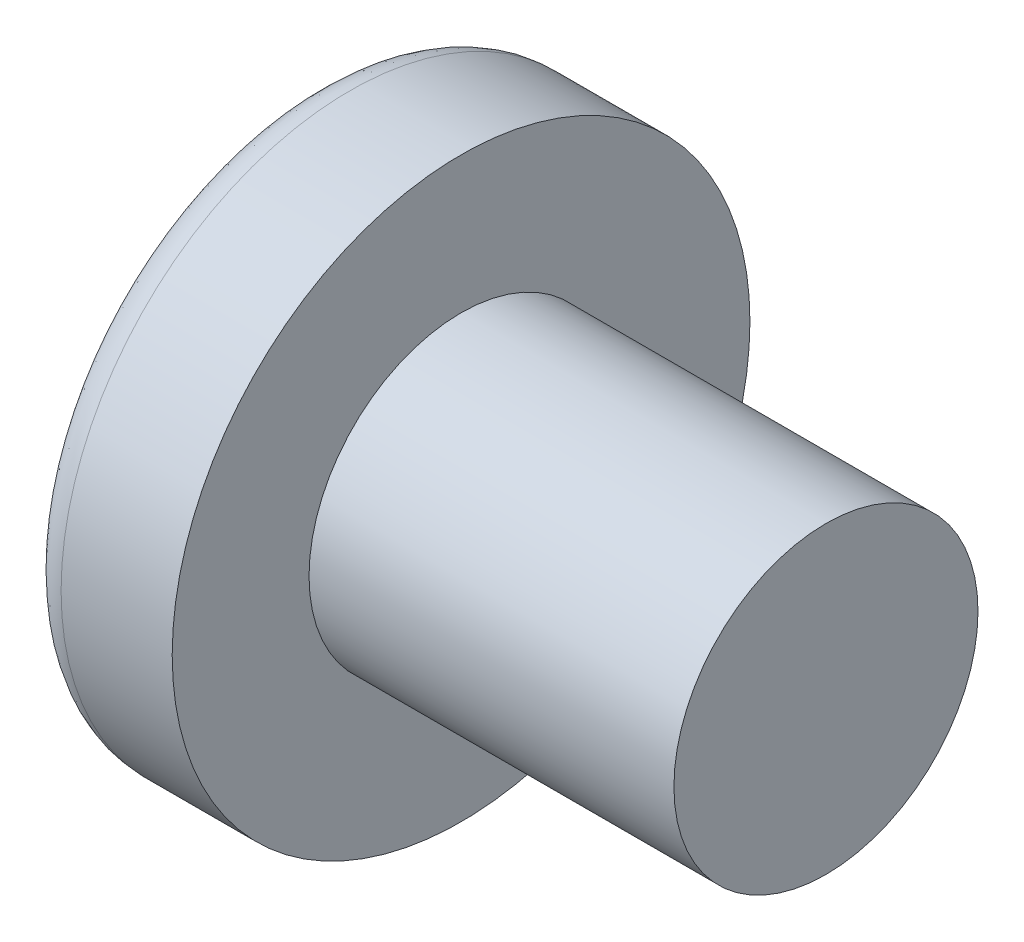
ISO-10303-21;
HEADER;
FILE_DESCRIPTION(('STEP AP214'),'2;1');
FILE_NAME('part.step','',(''),(''),'','','');
FILE_SCHEMA(('AUTOMOTIVE_DESIGN { 1 0 10303 214 1 1 1 1 }'));
ENDSEC;
DATA;
#1=APPLICATION_CONTEXT('core data for automotive mechanical design processes');
#2=APPLICATION_PROTOCOL_DEFINITION('international standard','automotive_design',2000,#1);
#3=PRODUCT_CONTEXT('',#1,'mechanical');
#4=PRODUCT('Part','Part','',(#3));
#5=PRODUCT_RELATED_PRODUCT_CATEGORY('part','',(#4));
#6=PRODUCT_DEFINITION_FORMATION('','',#4);
#7=PRODUCT_DEFINITION_CONTEXT('part definition',#1,'design');
#8=PRODUCT_DEFINITION('design','',#6,#7);
#9=PRODUCT_DEFINITION_SHAPE('','',#8);
#10=(LENGTH_UNIT() NAMED_UNIT(*) SI_UNIT(.MILLI.,.METRE.));
#11=(NAMED_UNIT(*) PLANE_ANGLE_UNIT() SI_UNIT($,.RADIAN.));
#12=(NAMED_UNIT(*) SI_UNIT($,.STERADIAN.) SOLID_ANGLE_UNIT());
#13=UNCERTAINTY_MEASURE_WITH_UNIT(LENGTH_MEASURE(1.E-05),#10,'distance_accuracy_value','');
#14=(GEOMETRIC_REPRESENTATION_CONTEXT(3) GLOBAL_UNCERTAINTY_ASSIGNED_CONTEXT((#13)) GLOBAL_UNIT_ASSIGNED_CONTEXT((#10,
#11,#12)) REPRESENTATION_CONTEXT('',''));
#15=CARTESIAN_POINT('',(0.,0.,0.));
#16=DIRECTION('',(0.,0.,1.));
#17=DIRECTION('',(1.,0.,0.));
#18=AXIS2_PLACEMENT_3D('',#15,#16,#17);
#19=CARTESIAN_POINT('',(8.,0.,0.));
#20=DIRECTION('',(-1.,0.,0.));
#21=DIRECTION('',(0.,1.,0.));
#22=AXIS2_PLACEMENT_3D('',#19,#20,#21);
#23=SPHERICAL_SURFACE('',#22,8.);
#24=CARTESIAN_POINT('',(1.37644815778014,0.,0.));
#25=DIRECTION('',(-1.,0.,0.));
#26=DIRECTION('',(0.,0.,1.));
#27=AXIS2_PLACEMENT_3D('',#24,#25,#26);
#28=CIRCLE('',#27,4.48648648648649);
#29=CARTESIAN_POINT('',(1.37644815778014,0.,4.48648648648649));
#30=VERTEX_POINT('',#29);
#31=EDGE_CURVE('E152',#30,#30,#28,.T.);
#32=ORIENTED_EDGE('',*,*,#31,.T.);
#33=EDGE_LOOP('',(#32));
#34=FACE_BOUND('',#33,.T.);
#35=CARTESIAN_POINT('',(7.98502567027952,-0.176697090701654,0.));
#36=DIRECTION('',(-0.0844430766861806,-0.996428304896931,0.));
#37=DIRECTION('',(0.996428304896931,-0.0844430766861806,0.));
#38=AXIS2_PLACEMENT_3D('',#35,#36,#37);
#39=CIRCLE('',#38,7.99803437774476);
#40=CARTESIAN_POINT('',(0.325131322777779,0.472446498069672,2.20752918301319));
#41=VERTEX_POINT('',#40);
#42=CARTESIAN_POINT('',(0.0309826509964171,0.497374351610471,0.497374351610473));
#43=VERTEX_POINT('',#42);
#44=EDGE_CURVE('E183',#41,#43,#39,.T.);
#45=ORIENTED_EDGE('',*,*,#44,.F.);
#46=CARTESIAN_POINT('',(6.31497138637622,0.,-2.25947018645006));
#47=DIRECTION('',(0.597823879730417,0.,0.801627475093059));
#48=DIRECTION('',(0.801627475093059,0.,-0.597823879730417));
#49=AXIS2_PLACEMENT_3D('',#46,#47,#48);
#50=CIRCLE('',#49,7.48702030502205);
#51=CARTESIAN_POINT('',(0.325131322777778,-0.472446498069688,2.20752918301318));
#52=VERTEX_POINT('',#51);
#53=EDGE_CURVE('E148',#41,#52,#50,.T.);
#54=ORIENTED_EDGE('',*,*,#53,.T.);
#55=CARTESIAN_POINT('',(7.98502567027952,0.176697090701654,0.));
#56=DIRECTION('',(-0.0844430766861805,0.996428304896931,0.));
#57=DIRECTION('',(-0.996428304896931,-0.0844430766861805,0.));
#58=AXIS2_PLACEMENT_3D('',#55,#56,#57);
#59=CIRCLE('',#58,7.99803437774476);
#60=CARTESIAN_POINT('',(0.0309826509964171,-0.497374351610475,0.497374351610473));
#61=VERTEX_POINT('',#60);
#62=EDGE_CURVE('E104',#61,#52,#59,.T.);
#63=ORIENTED_EDGE('',*,*,#62,.F.);
#64=CARTESIAN_POINT('',(7.98502567027952,0.,-0.176697090701654));
#65=DIRECTION('',(-0.0844430766861805,0.,-0.996428304896931));
#66=DIRECTION('',(-0.996428304896931,0.,0.0844430766861805));
#67=AXIS2_PLACEMENT_3D('',#64,#65,#66);
#68=CIRCLE('',#67,7.99803437774476);
#69=CARTESIAN_POINT('',(0.325131322777776,-2.20752918301318,0.47244649806968));
#70=VERTEX_POINT('',#69);
#71=EDGE_CURVE('E129',#70,#61,#68,.T.);
#72=ORIENTED_EDGE('',*,*,#71,.F.);
#73=CARTESIAN_POINT('',(6.31497138637622,2.25947018645006,0.));
#74=DIRECTION('',(0.597823879730417,-0.801627475093059,0.));
#75=DIRECTION('',(0.801627475093059,0.597823879730417,0.));
#76=AXIS2_PLACEMENT_3D('',#73,#74,#75);
#77=CIRCLE('',#76,7.48702030502205);
#78=CARTESIAN_POINT('',(0.325131322777776,-2.20752918301318,-0.47244649806968));
#79=VERTEX_POINT('',#78);
#80=EDGE_CURVE('E137',#70,#79,#77,.T.);
#81=ORIENTED_EDGE('',*,*,#80,.T.);
#82=CARTESIAN_POINT('',(7.98502567027952,0.,0.176697090701654));
#83=DIRECTION('',(-0.0844430766861806,0.,0.996428304896931));
#84=DIRECTION('',(0.996428304896931,0.,0.0844430766861806));
#85=AXIS2_PLACEMENT_3D('',#82,#83,#84);
#86=CIRCLE('',#85,7.99803437774476);
#87=CARTESIAN_POINT('',(0.0309826509964171,-0.497374351610471,-0.497374351610473));
#88=VERTEX_POINT('',#87);
#89=EDGE_CURVE('E47',#88,#79,#86,.T.);
#90=ORIENTED_EDGE('',*,*,#89,.F.);
#91=CARTESIAN_POINT('',(0.325131322777777,-0.472446498069672,-2.20752918301319));
#92=VERTEX_POINT('',#91);
#93=EDGE_CURVE('E190',#92,#88,#59,.T.);
#94=ORIENTED_EDGE('',*,*,#93,.F.);
#95=CARTESIAN_POINT('',(6.31497138637622,0.,2.25947018645006));
#96=DIRECTION('',(0.597823879730417,0.,-0.801627475093059));
#97=DIRECTION('',(-0.801627475093059,0.,-0.597823879730417));
#98=AXIS2_PLACEMENT_3D('',#95,#96,#97);
#99=CIRCLE('',#98,7.48702030502205);
#100=CARTESIAN_POINT('',(0.325131322777777,0.472446498069688,-2.20752918301318));
#101=VERTEX_POINT('',#100);
#102=EDGE_CURVE('E130',#92,#101,#99,.T.);
#103=ORIENTED_EDGE('',*,*,#102,.T.);
#104=CARTESIAN_POINT('',(0.0309826509964171,0.497374351610475,-0.497374351610473));
#105=VERTEX_POINT('',#104);
#106=EDGE_CURVE('E178',#105,#101,#39,.T.);
#107=ORIENTED_EDGE('',*,*,#106,.F.);
#108=CARTESIAN_POINT('',(0.325131322777778,2.20752918301318,-0.47244649806968));
#109=VERTEX_POINT('',#108);
#110=EDGE_CURVE('E40',#109,#105,#86,.T.);
#111=ORIENTED_EDGE('',*,*,#110,.F.);
#112=CARTESIAN_POINT('',(6.31497138637622,-2.25947018645007,0.));
#113=DIRECTION('',(0.597823879730417,0.801627475093059,0.));
#114=DIRECTION('',(-0.801627475093059,0.597823879730417,0.));
#115=AXIS2_PLACEMENT_3D('',#112,#113,#114);
#116=CIRCLE('',#115,7.48702030502205);
#117=CARTESIAN_POINT('',(0.325131322777778,2.20752918301318,0.47244649806968));
#118=VERTEX_POINT('',#117);
#119=EDGE_CURVE('E11',#109,#118,#116,.T.);
#120=ORIENTED_EDGE('',*,*,#119,.T.);
#121=EDGE_CURVE('E166',#43,#118,#68,.T.);
#122=ORIENTED_EDGE('',*,*,#121,.F.);
#123=EDGE_LOOP('',(#45,#54,#63,#72,#81,#90,#94,#103,#107,#111,#120,#122));
#124=FACE_BOUND('',#123,.T.);
#125=ADVANCED_FACE('F32',(#34,#124),#23,.T.);
#126=CARTESIAN_POINT('',(3.28522727272727,0.,-0.221590909090909));
#127=DIRECTION('',(-0.0844430766861806,0.,0.996428304896931));
#128=DIRECTION('',(0.996428304896931,0.,0.0844430766861806));
#129=AXIS2_PLACEMENT_3D('',#126,#127,#128);
#130=PLANE('',#129);
#131=ORIENTED_EDGE('',*,*,#110,.T.);
#132=DIRECTION('',(0.992894609445471,-0.0841436109699554,0.0841436109699551));
#133=VECTOR('',#132,1.);
#134=CARTESIAN_POINT('',(3.30374024870626,0.220022012821504,-0.220022012821503));
#135=LINE('',#134,#133);
#136=CARTESIAN_POINT('',(2.95,0.250000000000001,-0.249999999999999));
#137=VERTEX_POINT('',#136);
#138=EDGE_CURVE('E172',#105,#137,#135,.T.);
#139=ORIENTED_EDGE('',*,*,#138,.T.);
#140=DIRECTION('',(0.799784057588365,-0.596449127693018,0.0677783099651157));
#141=VECTOR('',#140,1.);
#142=CARTESIAN_POINT('',(0.,2.45,-0.5));
#143=LINE('',#142,#141);
#144=EDGE_CURVE('E153',#109,#137,#143,.T.);
#145=ORIENTED_EDGE('',*,*,#144,.F.);
#146=EDGE_LOOP('',(#131,#139,#145));
#147=FACE_BOUND('',#146,.T.);
#148=ADVANCED_FACE('F171',(#147),#130,.T.);
#149=DIRECTION('',(0.799784057588366,0.596449127693018,0.0677783099651157));
#150=VECTOR('',#149,1.);
#151=CARTESIAN_POINT('',(0.,-2.45,-0.5));
#152=LINE('',#151,#150);
#153=CARTESIAN_POINT('',(2.95,-0.25,-0.25));
#154=VERTEX_POINT('',#153);
#155=EDGE_CURVE('E138',#79,#154,#152,.T.);
#156=ORIENTED_EDGE('',*,*,#155,.T.);
#157=DIRECTION('',(-0.992894609445471,-0.0841436109699547,-0.0841436109699551));
#158=VECTOR('',#157,1.);
#159=CARTESIAN_POINT('',(3.30374024870626,-0.220022012821502,-0.220022012821503));
#160=LINE('',#159,#158);
#161=EDGE_CURVE('E193',#154,#88,#160,.T.);
#162=ORIENTED_EDGE('',*,*,#161,.T.);
#163=ORIENTED_EDGE('',*,*,#89,.T.);
#164=EDGE_LOOP('',(#156,#162,#163));
#165=FACE_BOUND('',#164,.T.);
#166=ADVANCED_FACE('F208',(#165),#130,.T.);
#167=CARTESIAN_POINT('',(3.28522727272727,0.,0.221590909090909));
#168=DIRECTION('',(-0.0844430766861805,0.,-0.996428304896931));
#169=DIRECTION('',(-0.996428304896931,0.,0.0844430766861805));
#170=AXIS2_PLACEMENT_3D('',#167,#168,#169);
#171=PLANE('',#170);
#172=DIRECTION('',(0.799784057588365,-0.596449127693018,-0.0677783099651157));
#173=VECTOR('',#172,1.);
#174=CARTESIAN_POINT('',(0.,2.45,0.5));
#175=LINE('',#174,#173);
#176=CARTESIAN_POINT('',(2.95,0.25,0.25));
#177=VERTEX_POINT('',#176);
#178=EDGE_CURVE('E209',#118,#177,#175,.T.);
#179=ORIENTED_EDGE('',*,*,#178,.T.);
#180=DIRECTION('',(-0.992894609445471,0.0841436109699548,0.084143610969955));
#181=VECTOR('',#180,1.);
#182=CARTESIAN_POINT('',(3.30374024870626,0.220022012821502,0.220022012821503));
#183=LINE('',#182,#181);
#184=EDGE_CURVE('E187',#177,#43,#183,.T.);
#185=ORIENTED_EDGE('',*,*,#184,.T.);
#186=ORIENTED_EDGE('',*,*,#121,.T.);
#187=EDGE_LOOP('',(#179,#185,#186));
#188=FACE_BOUND('',#187,.T.);
#189=ADVANCED_FACE('F213',(#188),#171,.T.);
#190=ORIENTED_EDGE('',*,*,#71,.T.);
#191=DIRECTION('',(0.992894609445471,0.0841436109699553,-0.084143610969955));
#192=VECTOR('',#191,1.);
#193=CARTESIAN_POINT('',(3.30374024870626,-0.220022012821504,0.220022012821503));
#194=LINE('',#193,#192);
#195=CARTESIAN_POINT('',(2.95,-0.250000000000001,0.249999999999999));
#196=VERTEX_POINT('',#195);
#197=EDGE_CURVE('E102',#61,#196,#194,.T.);
#198=ORIENTED_EDGE('',*,*,#197,.T.);
#199=DIRECTION('',(0.799784057588366,0.596449127693018,-0.0677783099651156));
#200=VECTOR('',#199,1.);
#201=CARTESIAN_POINT('',(0.,-2.45,0.499999999999999));
#202=LINE('',#201,#200);
#203=EDGE_CURVE('E127',#70,#196,#202,.T.);
#204=ORIENTED_EDGE('',*,*,#203,.F.);
#205=EDGE_LOOP('',(#190,#198,#204));
#206=FACE_BOUND('',#205,.T.);
#207=ADVANCED_FACE('F126',(#206),#171,.T.);
#208=CARTESIAN_POINT('',(-25.4,0.,0.));
#209=DIRECTION('',(-1.,0.,0.));
#210=DIRECTION('',(0.,0.,1.));
#211=AXIS2_PLACEMENT_3D('',#208,#209,#210);
#212=CYLINDRICAL_SURFACE('',#211,2.5);
#213=CARTESIAN_POINT('',(9.7,0.,0.));
#214=DIRECTION('',(-1.,0.,0.));
#215=DIRECTION('',(0.,0.,1.));
#216=AXIS2_PLACEMENT_3D('',#213,#214,#215);
#217=CIRCLE('',#216,2.5);
#218=CARTESIAN_POINT('',(9.7,0.,2.5));
#219=VERTEX_POINT('',#218);
#220=EDGE_CURVE('E149',#219,#219,#217,.T.);
#221=ORIENTED_EDGE('',*,*,#220,.T.);
#222=EDGE_LOOP('',(#221));
#223=FACE_BOUND('',#222,.T.);
#224=CARTESIAN_POINT('',(3.7,0.,0.));
#225=DIRECTION('',(-1.,0.,0.));
#226=DIRECTION('',(0.,0.,1.));
#227=AXIS2_PLACEMENT_3D('',#224,#225,#226);
#228=CIRCLE('',#227,2.5);
#229=CARTESIAN_POINT('',(3.7,0.,2.5));
#230=VERTEX_POINT('',#229);
#231=EDGE_CURVE('E162',#230,#230,#228,.T.);
#232=ORIENTED_EDGE('',*,*,#231,.F.);
#233=EDGE_LOOP('',(#232));
#234=FACE_BOUND('',#233,.T.);
#235=ADVANCED_FACE('F34',(#223,#234),#212,.T.);
#236=CARTESIAN_POINT('',(3.7,2.5,0.));
#237=DIRECTION('',(-1.,0.,0.));
#238=DIRECTION('',(0.,0.,1.));
#239=AXIS2_PLACEMENT_3D('',#236,#237,#238);
#240=PLANE('',#239);
#241=CARTESIAN_POINT('',(3.7,0.,0.));
#242=DIRECTION('',(-1.,0.,0.));
#243=DIRECTION('',(0.,0.,1.));
#244=AXIS2_PLACEMENT_3D('',#241,#242,#243);
#245=CIRCLE('',#244,4.75);
#246=CARTESIAN_POINT('',(3.7,0.,4.75));
#247=VERTEX_POINT('',#246);
#248=EDGE_CURVE('E159',#247,#247,#245,.T.);
#249=ORIENTED_EDGE('',*,*,#248,.F.);
#250=EDGE_LOOP('',(#249));
#251=FACE_BOUND('',#250,.T.);
#252=ORIENTED_EDGE('',*,*,#231,.T.);
#253=EDGE_LOOP('',(#252));
#254=FACE_BOUND('',#253,.T.);
#255=ADVANCED_FACE('F241',(#251,#254),#240,.F.);
#256=CARTESIAN_POINT('',(-25.4,0.,0.));
#257=DIRECTION('',(-1.,0.,0.));
#258=DIRECTION('',(0.,0.,1.));
#259=AXIS2_PLACEMENT_3D('',#256,#257,#258);
#260=CYLINDRICAL_SURFACE('',#259,4.75);
#261=ORIENTED_EDGE('',*,*,#248,.T.);
#262=EDGE_LOOP('',(#261));
#263=FACE_BOUND('',#262,.T.);
#264=CARTESIAN_POINT('',(1.87321454594663,0.,0.));
#265=DIRECTION('',(-1.,0.,0.));
#266=DIRECTION('',(0.,0.,1.));
#267=AXIS2_PLACEMENT_3D('',#264,#265,#266);
#268=CIRCLE('',#267,4.75);
#269=CARTESIAN_POINT('',(1.87321454594663,0.,4.75));
#270=VERTEX_POINT('',#269);
#271=EDGE_CURVE('E156',#270,#270,#268,.T.);
#272=ORIENTED_EDGE('',*,*,#271,.F.);
#273=EDGE_LOOP('',(#272));
#274=FACE_BOUND('',#273,.T.);
#275=ADVANCED_FACE('F238',(#263,#274),#260,.T.);
#276=CARTESIAN_POINT('',(1.87321454594663,0.,0.));
#277=DIRECTION('',(-1.,0.,0.));
#278=DIRECTION('',(0.,0.,1.));
#279=AXIS2_PLACEMENT_3D('',#276,#277,#278);
#280=TOROIDAL_SURFACE('',#279,4.15,0.599999999999998);
#281=ORIENTED_EDGE('',*,*,#271,.T.);
#282=EDGE_LOOP('',(#281));
#283=FACE_BOUND('',#282,.T.);
#284=ORIENTED_EDGE('',*,*,#31,.F.);
#285=EDGE_LOOP('',(#284));
#286=FACE_BOUND('',#285,.T.);
#287=ADVANCED_FACE('F235',(#283,#286),#280,.T.);
#288=CARTESIAN_POINT('',(9.7,2.5,0.));
#289=DIRECTION('',(1.,0.,0.));
#290=DIRECTION('',(0.,0.,-1.));
#291=AXIS2_PLACEMENT_3D('',#288,#289,#290);
#292=PLANE('',#291);
#293=ORIENTED_EDGE('',*,*,#220,.F.);
#294=EDGE_LOOP('',(#293));
#295=FACE_BOUND('',#294,.T.);
#296=ADVANCED_FACE('F233',(#295),#292,.T.);
#297=CARTESIAN_POINT('',(2.95,0.25,0.25));
#298=DIRECTION('',(0.597823879730417,0.801627475093059,0.));
#299=DIRECTION('',(-0.801627475093059,0.597823879730417,0.));
#300=AXIS2_PLACEMENT_3D('',#297,#298,#299);
#301=PLANE('',#300);
#302=ORIENTED_EDGE('',*,*,#144,.T.);
#303=DIRECTION('',(0.,0.,-1.));
#304=VECTOR('',#303,1.);
#305=CARTESIAN_POINT('',(2.95,0.25,0.25));
#306=LINE('',#305,#304);
#307=EDGE_CURVE('E120',#177,#137,#306,.T.);
#308=ORIENTED_EDGE('',*,*,#307,.F.);
#309=ORIENTED_EDGE('',*,*,#178,.F.);
#310=ORIENTED_EDGE('',*,*,#119,.F.);
#311=EDGE_LOOP('',(#302,#308,#309,#310));
#312=FACE_BOUND('',#311,.T.);
#313=ADVANCED_FACE('F212',(#312),#301,.F.);
#314=CARTESIAN_POINT('',(2.95,-0.25,-0.25));
#315=DIRECTION('',(0.597823879730417,-0.801627475093059,0.));
#316=DIRECTION('',(0.801627475093059,0.597823879730417,0.));
#317=AXIS2_PLACEMENT_3D('',#314,#315,#316);
#318=PLANE('',#317);
#319=ORIENTED_EDGE('',*,*,#203,.T.);
#320=DIRECTION('',(0.,0.,1.));
#321=VECTOR('',#320,1.);
#322=CARTESIAN_POINT('',(2.95,-0.25,-0.25));
#323=LINE('',#322,#321);
#324=EDGE_CURVE('E119',#154,#196,#323,.T.);
#325=ORIENTED_EDGE('',*,*,#324,.F.);
#326=ORIENTED_EDGE('',*,*,#155,.F.);
#327=ORIENTED_EDGE('',*,*,#80,.F.);
#328=EDGE_LOOP('',(#319,#325,#326,#327));
#329=FACE_BOUND('',#328,.T.);
#330=ADVANCED_FACE('F134',(#329),#318,.F.);
#331=CARTESIAN_POINT('',(2.95,0.25,-0.25));
#332=DIRECTION('',(-1.,0.,0.));
#333=DIRECTION('',(0.,0.,1.));
#334=AXIS2_PLACEMENT_3D('',#331,#332,#333);
#335=PLANE('',#334);
#336=DIRECTION('',(0.,1.,0.));
#337=VECTOR('',#336,1.);
#338=CARTESIAN_POINT('',(2.95,-0.25,-0.25));
#339=LINE('',#338,#337);
#340=EDGE_CURVE('E142',#154,#137,#339,.T.);
#341=ORIENTED_EDGE('',*,*,#340,.F.);
#342=ORIENTED_EDGE('',*,*,#324,.T.);
#343=DIRECTION('',(0.,-1.,0.));
#344=VECTOR('',#343,1.);
#345=CARTESIAN_POINT('',(2.95,0.25,0.25));
#346=LINE('',#345,#344);
#347=EDGE_CURVE('E111',#177,#196,#346,.T.);
#348=ORIENTED_EDGE('',*,*,#347,.F.);
#349=ORIENTED_EDGE('',*,*,#307,.T.);
#350=EDGE_LOOP('',(#341,#342,#348,#349));
#351=FACE_BOUND('',#350,.T.);
#352=ADVANCED_FACE('F140',(#351),#335,.T.);
#353=CARTESIAN_POINT('',(2.95,0.250000000000001,-0.249999999999999));
#354=DIRECTION('',(0.597823879730417,0.,-0.801627475093059));
#355=DIRECTION('',(0.801627475093059,0.,0.597823879730417));
#356=AXIS2_PLACEMENT_3D('',#353,#354,#355);
#357=PLANE('',#356);
#358=DIRECTION('',(0.799784057588366,0.0677783099651135,0.596449127693018));
#359=VECTOR('',#358,1.);
#360=CARTESIAN_POINT('',(0.,-0.499999999999991,-2.45));
#361=LINE('',#360,#359);
#362=EDGE_CURVE('E198',#92,#154,#361,.T.);
#363=ORIENTED_EDGE('',*,*,#362,.T.);
#364=ORIENTED_EDGE('',*,*,#340,.T.);
#365=DIRECTION('',(0.799784057588366,-0.0677783099651178,0.596449127693018));
#366=VECTOR('',#365,1.);
#367=CARTESIAN_POINT('',(0.,0.500000000000009,-2.45));
#368=LINE('',#367,#366);
#369=EDGE_CURVE('E108',#101,#137,#368,.T.);
#370=ORIENTED_EDGE('',*,*,#369,.F.);
#371=ORIENTED_EDGE('',*,*,#102,.F.);
#372=EDGE_LOOP('',(#363,#364,#370,#371));
#373=FACE_BOUND('',#372,.T.);
#374=ADVANCED_FACE('F203',(#373),#357,.F.);
#375=CARTESIAN_POINT('',(3.28522727272727,-0.221590909090909,0.));
#376=DIRECTION('',(-0.0844430766861805,0.996428304896931,0.));
#377=DIRECTION('',(-0.996428304896931,-0.0844430766861805,0.));
#378=AXIS2_PLACEMENT_3D('',#375,#376,#377);
#379=PLANE('',#378);
#380=ORIENTED_EDGE('',*,*,#93,.T.);
#381=ORIENTED_EDGE('',*,*,#161,.F.);
#382=ORIENTED_EDGE('',*,*,#362,.F.);
#383=EDGE_LOOP('',(#380,#381,#382));
#384=FACE_BOUND('',#383,.T.);
#385=ADVANCED_FACE('F207',(#384),#379,.T.);
#386=CARTESIAN_POINT('',(3.28522727272727,0.221590909090909,0.));
#387=DIRECTION('',(-0.0844430766861806,-0.996428304896931,0.));
#388=DIRECTION('',(0.996428304896931,-0.0844430766861806,0.));
#389=AXIS2_PLACEMENT_3D('',#386,#387,#388);
#390=PLANE('',#389);
#391=ORIENTED_EDGE('',*,*,#106,.T.);
#392=ORIENTED_EDGE('',*,*,#369,.T.);
#393=ORIENTED_EDGE('',*,*,#138,.F.);
#394=EDGE_LOOP('',(#391,#392,#393));
#395=FACE_BOUND('',#394,.T.);
#396=ADVANCED_FACE('F201',(#395),#390,.T.);
#397=CARTESIAN_POINT('',(2.95,-0.250000000000001,0.249999999999999));
#398=DIRECTION('',(0.597823879730417,0.,0.801627475093059));
#399=DIRECTION('',(-0.801627475093059,0.,0.597823879730417));
#400=AXIS2_PLACEMENT_3D('',#397,#398,#399);
#401=PLANE('',#400);
#402=DIRECTION('',(0.799784057588365,-0.0677783099651136,-0.596449127693019));
#403=VECTOR('',#402,1.);
#404=CARTESIAN_POINT('',(0.,0.499999999999991,2.45));
#405=LINE('',#404,#403);
#406=EDGE_CURVE('E107',#41,#177,#405,.T.);
#407=ORIENTED_EDGE('',*,*,#406,.T.);
#408=ORIENTED_EDGE('',*,*,#347,.T.);
#409=DIRECTION('',(0.799784057588365,0.0677783099651178,-0.596449127693018));
#410=VECTOR('',#409,1.);
#411=CARTESIAN_POINT('',(0.,-0.500000000000008,2.45));
#412=LINE('',#411,#410);
#413=EDGE_CURVE('E98',#52,#196,#412,.T.);
#414=ORIENTED_EDGE('',*,*,#413,.F.);
#415=ORIENTED_EDGE('',*,*,#53,.F.);
#416=EDGE_LOOP('',(#407,#408,#414,#415));
#417=FACE_BOUND('',#416,.T.);
#418=ADVANCED_FACE('F112',(#417),#401,.F.);
#419=ORIENTED_EDGE('',*,*,#44,.T.);
#420=ORIENTED_EDGE('',*,*,#184,.F.);
#421=ORIENTED_EDGE('',*,*,#406,.F.);
#422=EDGE_LOOP('',(#419,#420,#421));
#423=FACE_BOUND('',#422,.T.);
#424=ADVANCED_FACE('F214',(#423),#390,.T.);
#425=ORIENTED_EDGE('',*,*,#62,.T.);
#426=ORIENTED_EDGE('',*,*,#413,.T.);
#427=ORIENTED_EDGE('',*,*,#197,.F.);
#428=EDGE_LOOP('',(#425,#426,#427));
#429=FACE_BOUND('',#428,.T.);
#430=ADVANCED_FACE('F100',(#429),#379,.T.);
#431=CLOSED_SHELL('',(#125,#148,#166,#189,#207,#235,#255,#275,#287,#296,#313,#330,#352,#374,
#385,#396,#418,#424,#430));
#432=MANIFOLD_SOLID_BREP('B2',#431);
#433=ADVANCED_BREP_SHAPE_REPRESENTATION('',(#18,#432),#14);
#434=SHAPE_DEFINITION_REPRESENTATION(#9,#433);
ENDSEC;
END-ISO-10303-21;
